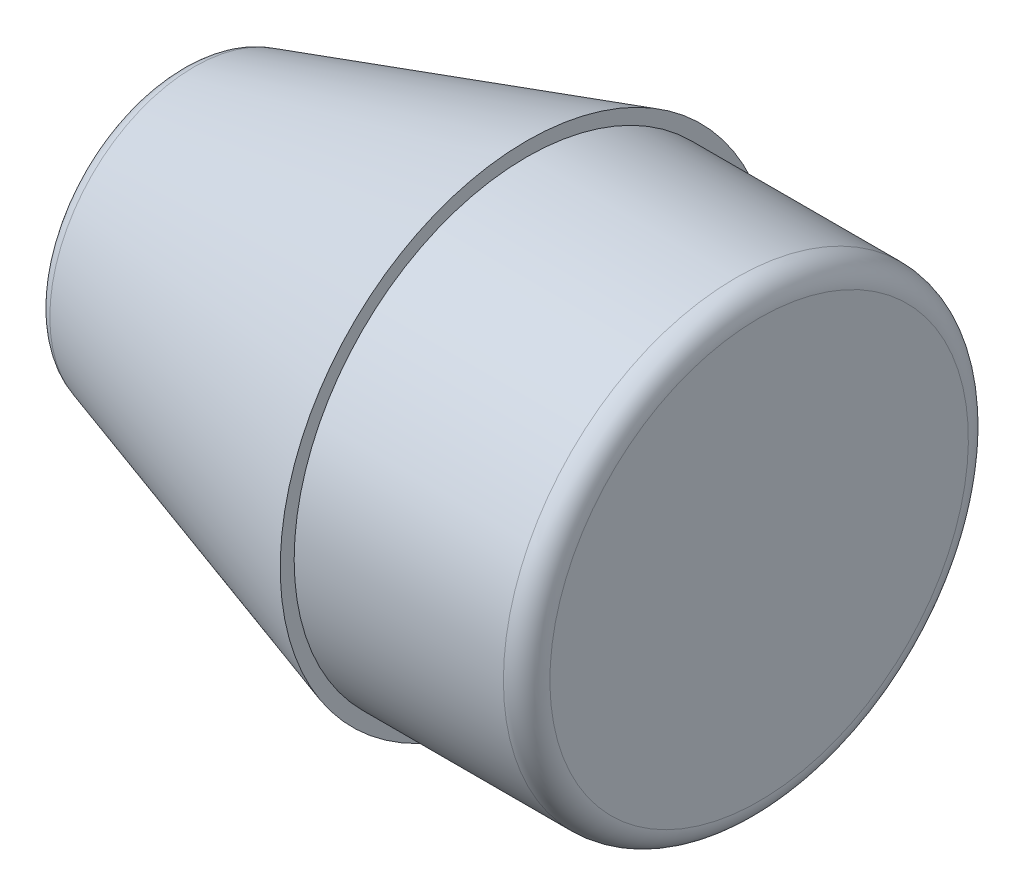
ISO-10303-21;
HEADER;
FILE_DESCRIPTION(('STEP AP214'),'2;1');
FILE_NAME('part.step','',(''),(''),'','','');
FILE_SCHEMA(('AUTOMOTIVE_DESIGN { 1 0 10303 214 1 1 1 1 }'));
ENDSEC;
DATA;
#1=APPLICATION_CONTEXT('core data for automotive mechanical design processes');
#2=APPLICATION_PROTOCOL_DEFINITION('international standard','automotive_design',2000,#1);
#3=PRODUCT_CONTEXT('',#1,'mechanical');
#4=PRODUCT('Part','Part','',(#3));
#5=PRODUCT_RELATED_PRODUCT_CATEGORY('part','',(#4));
#6=PRODUCT_DEFINITION_FORMATION('','',#4);
#7=PRODUCT_DEFINITION_CONTEXT('part definition',#1,'design');
#8=PRODUCT_DEFINITION('design','',#6,#7);
#9=PRODUCT_DEFINITION_SHAPE('','',#8);
#10=(LENGTH_UNIT() NAMED_UNIT(*) SI_UNIT(.MILLI.,.METRE.));
#11=(NAMED_UNIT(*) PLANE_ANGLE_UNIT() SI_UNIT($,.RADIAN.));
#12=(NAMED_UNIT(*) SI_UNIT($,.STERADIAN.) SOLID_ANGLE_UNIT());
#13=UNCERTAINTY_MEASURE_WITH_UNIT(LENGTH_MEASURE(1.E-05),#10,'distance_accuracy_value','');
#14=(GEOMETRIC_REPRESENTATION_CONTEXT(3) GLOBAL_UNCERTAINTY_ASSIGNED_CONTEXT((#13)) GLOBAL_UNIT_ASSIGNED_CONTEXT((#10,
#11,#12)) REPRESENTATION_CONTEXT('',''));
#15=CARTESIAN_POINT('',(0.,0.,0.));
#16=DIRECTION('',(0.,0.,1.));
#17=DIRECTION('',(1.,0.,0.));
#18=AXIS2_PLACEMENT_3D('',#15,#16,#17);
#19=CARTESIAN_POINT('',(0.,0.,0.));
#20=DIRECTION('',(-1.,0.,0.));
#21=DIRECTION('',(0.,-1.,0.));
#22=AXIS2_PLACEMENT_3D('',#19,#20,#21);
#23=PLANE('',#22);
#24=CARTESIAN_POINT('',(0.,0.,0.));
#25=DIRECTION('',(-1.,0.,0.));
#26=DIRECTION('',(0.,-1.,0.));
#27=AXIS2_PLACEMENT_3D('',#24,#25,#26);
#28=CIRCLE('',#27,2.63035043580119);
#29=CARTESIAN_POINT('',(0.,-2.63035043580119,0.));
#30=VERTEX_POINT('',#29);
#31=EDGE_CURVE('E10',#30,#30,#28,.T.);
#32=ORIENTED_EDGE('',*,*,#31,.T.);
#33=EDGE_LOOP('',(#32));
#34=FACE_BOUND('',#33,.T.);
#35=ADVANCED_FACE('F33',(#34),#23,.T.);
#36=CARTESIAN_POINT('',(7.5,0.,0.));
#37=DIRECTION('',(1.,0.,0.));
#38=DIRECTION('',(0.,1.,0.));
#39=AXIS2_PLACEMENT_3D('',#36,#37,#38);
#40=CONICAL_SURFACE('',#39,5.3,0.297561724737806);
#41=CARTESIAN_POINT('',(0.353405021409986,0.,0.));
#42=DIRECTION('',(-1.,0.,0.));
#43=DIRECTION('',(0.,-1.,0.));
#44=AXIS2_PLACEMENT_3D('',#41,#42,#43);
#45=CIRCLE('',#44,3.10837753989906);
#46=CARTESIAN_POINT('',(0.353405021409986,-3.10837753989906,0.));
#47=VERTEX_POINT('',#46);
#48=EDGE_CURVE('E40',#47,#47,#45,.F.);
#49=ORIENTED_EDGE('',*,*,#48,.T.);
#50=EDGE_LOOP('',(#49));
#51=FACE_BOUND('',#50,.T.);
#52=CARTESIAN_POINT('',(7.5,0.,0.));
#53=DIRECTION('',(1.,0.,0.));
#54=DIRECTION('',(0.,1.,0.));
#55=AXIS2_PLACEMENT_3D('',#52,#53,#54);
#56=CIRCLE('',#55,5.3);
#57=CARTESIAN_POINT('',(7.5,5.3,0.));
#58=VERTEX_POINT('',#57);
#59=EDGE_CURVE('E53',#58,#58,#56,.T.);
#60=ORIENTED_EDGE('',*,*,#59,.F.);
#61=EDGE_LOOP('',(#60));
#62=FACE_BOUND('',#61,.T.);
#63=ADVANCED_FACE('F64',(#51,#62),#40,.T.);
#64=CARTESIAN_POINT('',(7.5,5.3,0.));
#65=DIRECTION('',(1.,0.,0.));
#66=DIRECTION('',(0.,1.,0.));
#67=AXIS2_PLACEMENT_3D('',#64,#65,#66);
#68=PLANE('',#67);
#69=ORIENTED_EDGE('',*,*,#59,.T.);
#70=EDGE_LOOP('',(#69));
#71=FACE_BOUND('',#70,.T.);
#72=CARTESIAN_POINT('',(7.5,0.,0.));
#73=DIRECTION('',(1.,0.,0.));
#74=DIRECTION('',(0.,1.,0.));
#75=AXIS2_PLACEMENT_3D('',#72,#73,#74);
#76=CIRCLE('',#75,5.);
#77=CARTESIAN_POINT('',(7.5,5.,0.));
#78=VERTEX_POINT('',#77);
#79=EDGE_CURVE('E56',#78,#78,#76,.T.);
#80=ORIENTED_EDGE('',*,*,#79,.F.);
#81=EDGE_LOOP('',(#80));
#82=FACE_BOUND('',#81,.T.);
#83=ADVANCED_FACE('F62',(#71,#82),#68,.T.);
#84=CARTESIAN_POINT('',(12.5,0.,0.));
#85=DIRECTION('',(1.,0.,0.));
#86=DIRECTION('',(0.,1.,0.));
#87=AXIS2_PLACEMENT_3D('',#84,#85,#86);
#88=CYLINDRICAL_SURFACE('',#87,5.);
#89=CARTESIAN_POINT('',(12.,0.,0.));
#90=DIRECTION('',(1.,0.,0.));
#91=DIRECTION('',(0.,1.,0.));
#92=AXIS2_PLACEMENT_3D('',#89,#90,#91);
#93=CIRCLE('',#92,5.);
#94=CARTESIAN_POINT('',(12.,5.,0.));
#95=VERTEX_POINT('',#94);
#96=EDGE_CURVE('E44',#95,#95,#93,.F.);
#97=ORIENTED_EDGE('',*,*,#96,.T.);
#98=EDGE_LOOP('',(#97));
#99=FACE_BOUND('',#98,.T.);
#100=ORIENTED_EDGE('',*,*,#79,.T.);
#101=EDGE_LOOP('',(#100));
#102=FACE_BOUND('',#101,.T.);
#103=ADVANCED_FACE('F60',(#99,#102),#88,.T.);
#104=CARTESIAN_POINT('',(12.5,5.,0.));
#105=DIRECTION('',(1.,0.,0.));
#106=DIRECTION('',(0.,1.,0.));
#107=AXIS2_PLACEMENT_3D('',#104,#105,#106);
#108=PLANE('',#107);
#109=CARTESIAN_POINT('',(12.5,0.,0.));
#110=DIRECTION('',(1.,0.,0.));
#111=DIRECTION('',(0.,1.,0.));
#112=AXIS2_PLACEMENT_3D('',#109,#110,#111);
#113=CIRCLE('',#112,4.5);
#114=CARTESIAN_POINT('',(12.5,4.5,0.));
#115=VERTEX_POINT('',#114);
#116=EDGE_CURVE('E48',#115,#115,#113,.T.);
#117=ORIENTED_EDGE('',*,*,#116,.T.);
#118=EDGE_LOOP('',(#117));
#119=FACE_BOUND('',#118,.T.);
#120=ADVANCED_FACE('F71',(#119),#108,.T.);
#121=CARTESIAN_POINT('',(12.,0.,0.));
#122=DIRECTION('',(1.,0.,0.));
#123=DIRECTION('',(0.,1.,0.));
#124=AXIS2_PLACEMENT_3D('',#121,#122,#123);
#125=TOROIDAL_SURFACE('',#124,4.5,0.5);
#126=ORIENTED_EDGE('',*,*,#96,.F.);
#127=EDGE_LOOP('',(#126));
#128=FACE_BOUND('',#127,.T.);
#129=ORIENTED_EDGE('',*,*,#116,.F.);
#130=EDGE_LOOP('',(#129));
#131=FACE_BOUND('',#130,.T.);
#132=ADVANCED_FACE('F79',(#128,#131),#125,.T.);
#133=CARTESIAN_POINT('',(0.5,0.,0.));
#134=DIRECTION('',(-1.,0.,0.));
#135=DIRECTION('',(0.,-1.,0.));
#136=AXIS2_PLACEMENT_3D('',#133,#134,#135);
#137=TOROIDAL_SURFACE('',#136,2.63035043580119,0.5);
#138=ORIENTED_EDGE('',*,*,#31,.F.);
#139=EDGE_LOOP('',(#138));
#140=FACE_BOUND('',#139,.T.);
#141=ORIENTED_EDGE('',*,*,#48,.F.);
#142=EDGE_LOOP('',(#141));
#143=FACE_BOUND('',#142,.T.);
#144=ADVANCED_FACE('F35',(#140,#143),#137,.T.);
#145=CLOSED_SHELL('',(#35,#63,#83,#103,#120,#132,#144));
#146=MANIFOLD_SOLID_BREP('B2',#145);
#147=ADVANCED_BREP_SHAPE_REPRESENTATION('',(#18,#146),#14);
#148=SHAPE_DEFINITION_REPRESENTATION(#9,#147);
ENDSEC;
END-ISO-10303-21;
